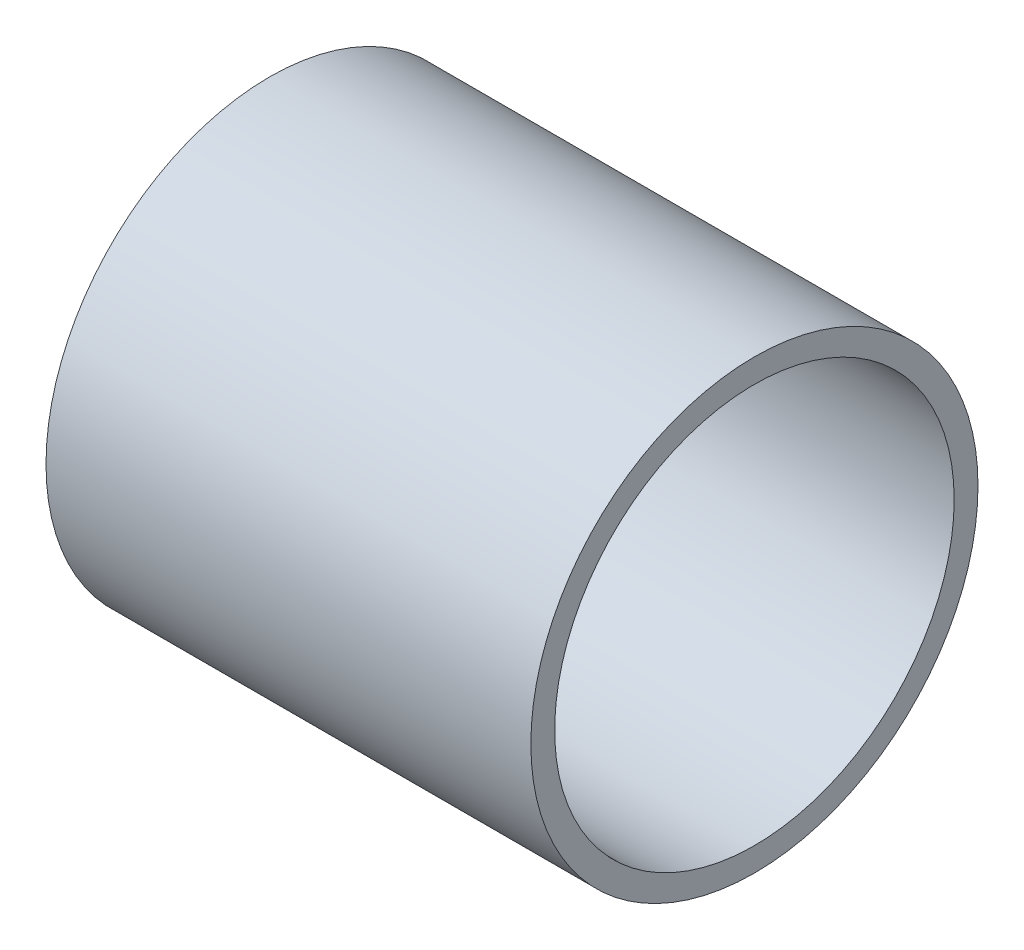
ISO-10303-21;
HEADER;
FILE_DESCRIPTION(('STEP AP214'),'2;1');
FILE_NAME('part.step','',(''),(''),'','','');
FILE_SCHEMA(('AUTOMOTIVE_DESIGN { 1 0 10303 214 1 1 1 1 }'));
ENDSEC;
DATA;
#1=APPLICATION_CONTEXT('core data for automotive mechanical design processes');
#2=APPLICATION_PROTOCOL_DEFINITION('international standard','automotive_design',2000,#1);
#3=PRODUCT_CONTEXT('',#1,'mechanical');
#4=PRODUCT('Part','Part','',(#3));
#5=PRODUCT_RELATED_PRODUCT_CATEGORY('part','',(#4));
#6=PRODUCT_DEFINITION_FORMATION('','',#4);
#7=PRODUCT_DEFINITION_CONTEXT('part definition',#1,'design');
#8=PRODUCT_DEFINITION('design','',#6,#7);
#9=PRODUCT_DEFINITION_SHAPE('','',#8);
#10=(LENGTH_UNIT() NAMED_UNIT(*) SI_UNIT(.MILLI.,.METRE.));
#11=(NAMED_UNIT(*) PLANE_ANGLE_UNIT() SI_UNIT($,.RADIAN.));
#12=(NAMED_UNIT(*) SI_UNIT($,.STERADIAN.) SOLID_ANGLE_UNIT());
#13=UNCERTAINTY_MEASURE_WITH_UNIT(LENGTH_MEASURE(1.E-05),#10,'distance_accuracy_value','');
#14=(GEOMETRIC_REPRESENTATION_CONTEXT(3) GLOBAL_UNCERTAINTY_ASSIGNED_CONTEXT((#13)) GLOBAL_UNIT_ASSIGNED_CONTEXT((#10,
#11,#12)) REPRESENTATION_CONTEXT('',''));
#15=CARTESIAN_POINT('',(0.,0.,0.));
#16=DIRECTION('',(0.,0.,1.));
#17=DIRECTION('',(1.,0.,0.));
#18=AXIS2_PLACEMENT_3D('',#15,#16,#17);
#19=CARTESIAN_POINT('',(25.4,0.,0.));
#20=DIRECTION('',(1.,0.,0.));
#21=DIRECTION('',(0.,0.,-1.));
#22=AXIS2_PLACEMENT_3D('',#19,#20,#21);
#23=PLANE('',#22);
#24=CARTESIAN_POINT('',(25.4,0.,0.));
#25=DIRECTION('',(1.,0.,0.));
#26=DIRECTION('',(0.,0.,-1.));
#27=AXIS2_PLACEMENT_3D('',#24,#25,#26);
#28=CIRCLE('',#27,11.712575);
#29=CARTESIAN_POINT('',(25.4,0.,-11.712575));
#30=VERTEX_POINT('',#29);
#31=EDGE_CURVE('E10',#30,#30,#28,.T.);
#32=ORIENTED_EDGE('',*,*,#31,.T.);
#33=EDGE_LOOP('',(#32));
#34=FACE_BOUND('',#33,.T.);
#35=CARTESIAN_POINT('',(25.4,0.,0.));
#36=DIRECTION('',(1.,0.,0.));
#37=DIRECTION('',(0.,0.,-1.));
#38=AXIS2_PLACEMENT_3D('',#35,#36,#37);
#39=CIRCLE('',#38,10.4648);
#40=CARTESIAN_POINT('',(25.4,0.,-10.4648));
#41=VERTEX_POINT('',#40);
#42=EDGE_CURVE('E41',#41,#41,#39,.T.);
#43=ORIENTED_EDGE('',*,*,#42,.F.);
#44=EDGE_LOOP('',(#43));
#45=FACE_BOUND('',#44,.T.);
#46=ADVANCED_FACE('F30',(#34,#45),#23,.T.);
#47=CARTESIAN_POINT('',(0.,0.,0.));
#48=DIRECTION('',(1.,0.,0.));
#49=DIRECTION('',(0.,0.,-1.));
#50=AXIS2_PLACEMENT_3D('',#47,#48,#49);
#51=PLANE('',#50);
#52=CARTESIAN_POINT('',(0.,0.,0.));
#53=DIRECTION('',(1.,0.,0.));
#54=DIRECTION('',(0.,0.,-1.));
#55=AXIS2_PLACEMENT_3D('',#52,#53,#54);
#56=CIRCLE('',#55,11.712575);
#57=CARTESIAN_POINT('',(0.,0.,-11.712575));
#58=VERTEX_POINT('',#57);
#59=EDGE_CURVE('E34',#58,#58,#56,.T.);
#60=ORIENTED_EDGE('',*,*,#59,.F.);
#61=EDGE_LOOP('',(#60));
#62=FACE_BOUND('',#61,.T.);
#63=CARTESIAN_POINT('',(0.,0.,0.));
#64=DIRECTION('',(1.,0.,0.));
#65=DIRECTION('',(0.,0.,-1.));
#66=AXIS2_PLACEMENT_3D('',#63,#64,#65);
#67=CIRCLE('',#66,10.4648);
#68=CARTESIAN_POINT('',(0.,0.,-10.4648));
#69=VERTEX_POINT('',#68);
#70=EDGE_CURVE('E43',#69,#69,#67,.T.);
#71=ORIENTED_EDGE('',*,*,#70,.T.);
#72=EDGE_LOOP('',(#71));
#73=FACE_BOUND('',#72,.T.);
#74=ADVANCED_FACE('F53',(#62,#73),#51,.F.);
#75=CARTESIAN_POINT('',(25.4,0.,0.));
#76=DIRECTION('',(-1.,0.,0.));
#77=DIRECTION('',(0.,0.,1.));
#78=AXIS2_PLACEMENT_3D('',#75,#76,#77);
#79=CYLINDRICAL_SURFACE('',#78,11.712575);
#80=ORIENTED_EDGE('',*,*,#31,.F.);
#81=EDGE_LOOP('',(#80));
#82=FACE_BOUND('',#81,.T.);
#83=ORIENTED_EDGE('',*,*,#59,.T.);
#84=EDGE_LOOP('',(#83));
#85=FACE_BOUND('',#84,.T.);
#86=ADVANCED_FACE('F32',(#82,#85),#79,.T.);
#87=CARTESIAN_POINT('',(25.4,0.,0.));
#88=DIRECTION('',(-1.,0.,0.));
#89=DIRECTION('',(0.,0.,1.));
#90=AXIS2_PLACEMENT_3D('',#87,#88,#89);
#91=CYLINDRICAL_SURFACE('',#90,10.4648);
#92=ORIENTED_EDGE('',*,*,#42,.T.);
#93=EDGE_LOOP('',(#92));
#94=FACE_BOUND('',#93,.T.);
#95=ORIENTED_EDGE('',*,*,#70,.F.);
#96=EDGE_LOOP('',(#95));
#97=FACE_BOUND('',#96,.T.);
#98=ADVANCED_FACE('F49',(#94,#97),#91,.F.);
#99=CLOSED_SHELL('',(#46,#74,#86,#98));
#100=MANIFOLD_SOLID_BREP('B2',#99);
#101=ADVANCED_BREP_SHAPE_REPRESENTATION('',(#18,#100),#14);
#102=SHAPE_DEFINITION_REPRESENTATION(#9,#101);
ENDSEC;
END-ISO-10303-21;
